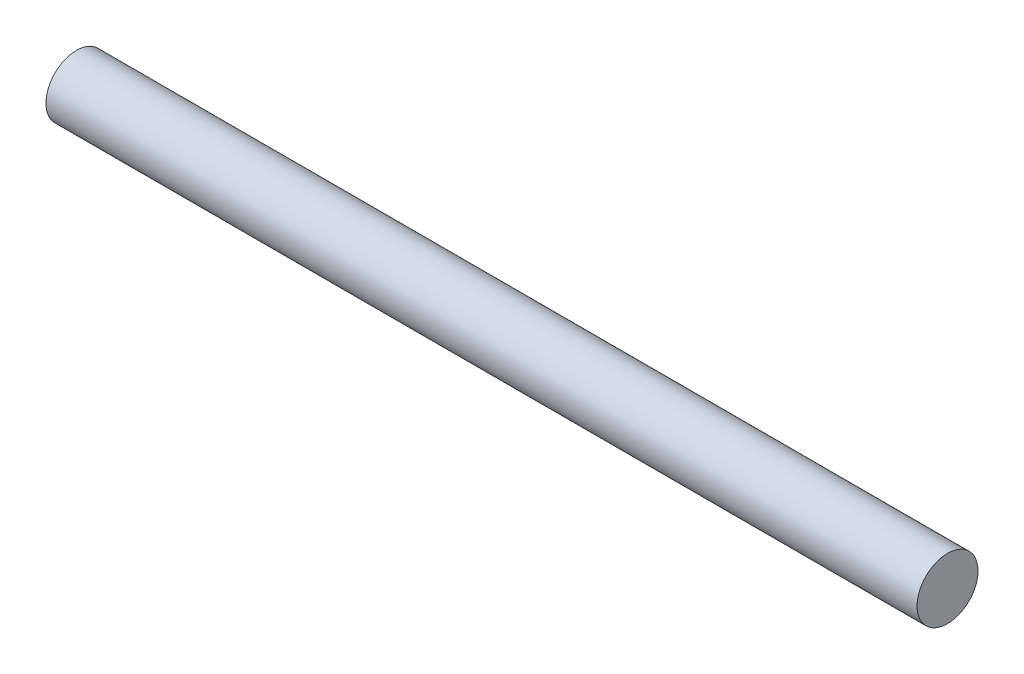
ISO-10303-21;
HEADER;
FILE_DESCRIPTION(('STEP AP214'),'2;1');
FILE_NAME('part.step','',(''),(''),'','','');
FILE_SCHEMA(('AUTOMOTIVE_DESIGN { 1 0 10303 214 1 1 1 1 }'));
ENDSEC;
DATA;
#1=APPLICATION_CONTEXT('core data for automotive mechanical design processes');
#2=APPLICATION_PROTOCOL_DEFINITION('international standard','automotive_design',2000,#1);
#3=PRODUCT_CONTEXT('',#1,'mechanical');
#4=PRODUCT('Part','Part','',(#3));
#5=PRODUCT_RELATED_PRODUCT_CATEGORY('part','',(#4));
#6=PRODUCT_DEFINITION_FORMATION('','',#4);
#7=PRODUCT_DEFINITION_CONTEXT('part definition',#1,'design');
#8=PRODUCT_DEFINITION('design','',#6,#7);
#9=PRODUCT_DEFINITION_SHAPE('','',#8);
#10=(LENGTH_UNIT() NAMED_UNIT(*) SI_UNIT(.MILLI.,.METRE.));
#11=(NAMED_UNIT(*) PLANE_ANGLE_UNIT() SI_UNIT($,.RADIAN.));
#12=(NAMED_UNIT(*) SI_UNIT($,.STERADIAN.) SOLID_ANGLE_UNIT());
#13=UNCERTAINTY_MEASURE_WITH_UNIT(LENGTH_MEASURE(1.E-05),#10,'distance_accuracy_value','');
#14=(GEOMETRIC_REPRESENTATION_CONTEXT(3) GLOBAL_UNCERTAINTY_ASSIGNED_CONTEXT((#13)) GLOBAL_UNIT_ASSIGNED_CONTEXT((#10,
#11,#12)) REPRESENTATION_CONTEXT('',''));
#15=CARTESIAN_POINT('',(0.,0.,0.));
#16=DIRECTION('',(0.,0.,1.));
#17=DIRECTION('',(1.,0.,0.));
#18=AXIS2_PLACEMENT_3D('',#15,#16,#17);
#19=CARTESIAN_POINT('',(1000.,0.,0.));
#20=DIRECTION('',(-1.,0.,0.));
#21=DIRECTION('',(0.,0.,1.));
#22=AXIS2_PLACEMENT_3D('',#19,#20,#21);
#23=CYLINDRICAL_SURFACE('',#22,35.);
#24=CARTESIAN_POINT('',(1000.,0.,0.));
#25=DIRECTION('',(1.,0.,0.));
#26=DIRECTION('',(0.,0.,-1.));
#27=AXIS2_PLACEMENT_3D('',#24,#25,#26);
#28=CIRCLE('',#27,35.);
#29=CARTESIAN_POINT('',(1000.,0.,-35.));
#30=VERTEX_POINT('',#29);
#31=EDGE_CURVE('E10',#30,#30,#28,.T.);
#32=ORIENTED_EDGE('',*,*,#31,.F.);
#33=EDGE_LOOP('',(#32));
#34=FACE_BOUND('',#33,.T.);
#35=CARTESIAN_POINT('',(0.,0.,0.));
#36=DIRECTION('',(1.,0.,0.));
#37=DIRECTION('',(0.,0.,-1.));
#38=AXIS2_PLACEMENT_3D('',#35,#36,#37);
#39=CIRCLE('',#38,35.);
#40=CARTESIAN_POINT('',(0.,0.,-35.));
#41=VERTEX_POINT('',#40);
#42=EDGE_CURVE('E44',#41,#41,#39,.T.);
#43=ORIENTED_EDGE('',*,*,#42,.T.);
#44=EDGE_LOOP('',(#43));
#45=FACE_BOUND('',#44,.T.);
#46=ADVANCED_FACE('F41',(#34,#45),#23,.T.);
#47=CARTESIAN_POINT('',(1000.,0.,0.));
#48=DIRECTION('',(1.,0.,0.));
#49=DIRECTION('',(0.,0.,-1.));
#50=AXIS2_PLACEMENT_3D('',#47,#48,#49);
#51=PLANE('',#50);
#52=ORIENTED_EDGE('',*,*,#31,.T.);
#53=EDGE_LOOP('',(#52));
#54=FACE_BOUND('',#53,.T.);
#55=ADVANCED_FACE('F58',(#54),#51,.T.);
#56=CARTESIAN_POINT('',(0.,0.,0.));
#57=DIRECTION('',(1.,0.,0.));
#58=DIRECTION('',(0.,0.,-1.));
#59=AXIS2_PLACEMENT_3D('',#56,#57,#58);
#60=PLANE('',#59);
#61=ORIENTED_EDGE('',*,*,#42,.F.);
#62=EDGE_LOOP('',(#61));
#63=FACE_BOUND('',#62,.T.);
#64=ADVANCED_FACE('F56',(#63),#60,.F.);
#65=CLOSED_SHELL('',(#46,#55,#64));
#66=MANIFOLD_SOLID_BREP('B2',#65);
#67=ADVANCED_BREP_SHAPE_REPRESENTATION('',(#18,#66),#14);
#68=SHAPE_DEFINITION_REPRESENTATION(#9,#67);
ENDSEC;
END-ISO-10303-21;
